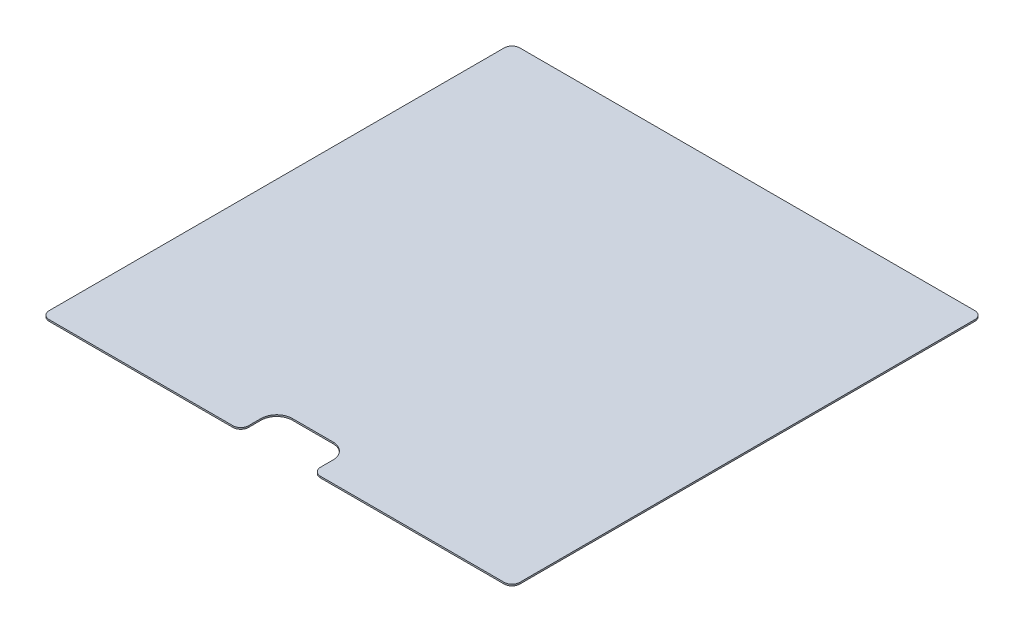
ISO-10303-21;
HEADER;
FILE_DESCRIPTION(('STEP AP214'),'2;1');
FILE_NAME('part.step','',(''),(''),'','','');
FILE_SCHEMA(('AUTOMOTIVE_DESIGN { 1 0 10303 214 1 1 1 1 }'));
ENDSEC;
DATA;
#1=APPLICATION_CONTEXT('core data for automotive mechanical design processes');
#2=APPLICATION_PROTOCOL_DEFINITION('international standard','automotive_design',2000,#1);
#3=PRODUCT_CONTEXT('',#1,'mechanical');
#4=PRODUCT('Part','Part','',(#3));
#5=PRODUCT_RELATED_PRODUCT_CATEGORY('part','',(#4));
#6=PRODUCT_DEFINITION_FORMATION('','',#4);
#7=PRODUCT_DEFINITION_CONTEXT('part definition',#1,'design');
#8=PRODUCT_DEFINITION('design','',#6,#7);
#9=PRODUCT_DEFINITION_SHAPE('','',#8);
#10=(LENGTH_UNIT() NAMED_UNIT(*) SI_UNIT(.MILLI.,.METRE.));
#11=(NAMED_UNIT(*) PLANE_ANGLE_UNIT() SI_UNIT($,.RADIAN.));
#12=(NAMED_UNIT(*) SI_UNIT($,.STERADIAN.) SOLID_ANGLE_UNIT());
#13=UNCERTAINTY_MEASURE_WITH_UNIT(LENGTH_MEASURE(1.E-05),#10,'distance_accuracy_value','');
#14=(GEOMETRIC_REPRESENTATION_CONTEXT(3) GLOBAL_UNCERTAINTY_ASSIGNED_CONTEXT((#13)) GLOBAL_UNIT_ASSIGNED_CONTEXT((#10,
#11,#12)) REPRESENTATION_CONTEXT('',''));
#15=CARTESIAN_POINT('',(0.,0.,0.));
#16=DIRECTION('',(0.,0.,1.));
#17=DIRECTION('',(1.,0.,0.));
#18=AXIS2_PLACEMENT_3D('',#15,#16,#17);
#19=CARTESIAN_POINT('',(-14.5,0.05,-14.5));
#20=DIRECTION('',(0.,-1.,0.));
#21=DIRECTION('',(0.,0.,-1.));
#22=AXIS2_PLACEMENT_3D('',#19,#20,#21);
#23=CYLINDRICAL_SURFACE('',#22,0.5);
#24=CARTESIAN_POINT('',(-14.5,-0.05,-14.5));
#25=DIRECTION('',(0.,1.,0.));
#26=DIRECTION('',(0.,0.,1.));
#27=AXIS2_PLACEMENT_3D('',#24,#25,#26);
#28=CIRCLE('',#27,0.5);
#29=CARTESIAN_POINT('',(-14.5,-0.05,-15.));
#30=VERTEX_POINT('',#29);
#31=CARTESIAN_POINT('',(-15.,-0.05,-14.5));
#32=VERTEX_POINT('',#31);
#33=EDGE_CURVE('E188',#30,#32,#28,.T.);
#34=ORIENTED_EDGE('',*,*,#33,.T.);
#35=DIRECTION('',(0.,-1.,0.));
#36=VECTOR('',#35,1.);
#37=CARTESIAN_POINT('',(-15.,0.05,-14.5));
#38=LINE('',#37,#36);
#39=CARTESIAN_POINT('',(-15.,0.05,-14.5));
#40=VERTEX_POINT('',#39);
#41=EDGE_CURVE('E11',#40,#32,#38,.T.);
#42=ORIENTED_EDGE('',*,*,#41,.F.);
#43=CARTESIAN_POINT('',(-14.5,0.05,-14.5));
#44=DIRECTION('',(0.,1.,0.));
#45=DIRECTION('',(0.,0.,1.));
#46=AXIS2_PLACEMENT_3D('',#43,#44,#45);
#47=CIRCLE('',#46,0.5);
#48=CARTESIAN_POINT('',(-14.5,0.05,-15.));
#49=VERTEX_POINT('',#48);
#50=EDGE_CURVE('E234',#49,#40,#47,.T.);
#51=ORIENTED_EDGE('',*,*,#50,.F.);
#52=DIRECTION('',(0.,-1.,0.));
#53=VECTOR('',#52,1.);
#54=CARTESIAN_POINT('',(-14.5,0.05,-15.));
#55=LINE('',#54,#53);
#56=EDGE_CURVE('E184',#49,#30,#55,.T.);
#57=ORIENTED_EDGE('',*,*,#56,.T.);
#58=EDGE_LOOP('',(#34,#42,#51,#57));
#59=FACE_BOUND('',#58,.T.);
#60=ADVANCED_FACE('F39',(#59),#23,.T.);
#61=CARTESIAN_POINT('',(-15.,0.05,14.5));
#62=DIRECTION('',(1.,0.,0.));
#63=DIRECTION('',(0.,0.,-1.));
#64=AXIS2_PLACEMENT_3D('',#61,#62,#63);
#65=PLANE('',#64);
#66=DIRECTION('',(0.,0.,1.));
#67=VECTOR('',#66,1.);
#68=CARTESIAN_POINT('',(-15.,-0.05,14.5));
#69=LINE('',#68,#67);
#70=CARTESIAN_POINT('',(-15.,-0.05,14.5));
#71=VERTEX_POINT('',#70);
#72=EDGE_CURVE('E192',#32,#71,#69,.T.);
#73=ORIENTED_EDGE('',*,*,#72,.T.);
#74=DIRECTION('',(0.,-1.,0.));
#75=VECTOR('',#74,1.);
#76=CARTESIAN_POINT('',(-15.,0.05,14.5));
#77=LINE('',#76,#75);
#78=CARTESIAN_POINT('',(-15.,0.05,14.5));
#79=VERTEX_POINT('',#78);
#80=EDGE_CURVE('E48',#79,#71,#77,.T.);
#81=ORIENTED_EDGE('',*,*,#80,.F.);
#82=DIRECTION('',(0.,0.,1.));
#83=VECTOR('',#82,1.);
#84=CARTESIAN_POINT('',(-15.,0.05,14.5));
#85=LINE('',#84,#83);
#86=EDGE_CURVE('E123',#40,#79,#85,.T.);
#87=ORIENTED_EDGE('',*,*,#86,.F.);
#88=ORIENTED_EDGE('',*,*,#41,.T.);
#89=EDGE_LOOP('',(#73,#81,#87,#88));
#90=FACE_BOUND('',#89,.T.);
#91=ADVANCED_FACE('F356',(#90),#65,.F.);
#92=CARTESIAN_POINT('',(-14.5,0.05,14.5));
#93=DIRECTION('',(0.,-1.,0.));
#94=DIRECTION('',(0.,0.,-1.));
#95=AXIS2_PLACEMENT_3D('',#92,#93,#94);
#96=CYLINDRICAL_SURFACE('',#95,0.5);
#97=CARTESIAN_POINT('',(-14.5,-0.05,14.5));
#98=DIRECTION('',(0.,1.,0.));
#99=DIRECTION('',(0.,0.,-1.));
#100=AXIS2_PLACEMENT_3D('',#97,#98,#99);
#101=CIRCLE('',#100,0.5);
#102=CARTESIAN_POINT('',(-14.5,-0.05,15.));
#103=VERTEX_POINT('',#102);
#104=EDGE_CURVE('E195',#71,#103,#101,.T.);
#105=ORIENTED_EDGE('',*,*,#104,.T.);
#106=DIRECTION('',(0.,-1.,0.));
#107=VECTOR('',#106,1.);
#108=CARTESIAN_POINT('',(-14.5,0.05,15.));
#109=LINE('',#108,#107);
#110=CARTESIAN_POINT('',(-14.5,0.05,15.));
#111=VERTEX_POINT('',#110);
#112=EDGE_CURVE('E277',#111,#103,#109,.T.);
#113=ORIENTED_EDGE('',*,*,#112,.F.);
#114=CARTESIAN_POINT('',(-14.5,0.05,14.5));
#115=DIRECTION('',(0.,1.,0.));
#116=DIRECTION('',(0.,0.,-1.));
#117=AXIS2_PLACEMENT_3D('',#114,#115,#116);
#118=CIRCLE('',#117,0.5);
#119=EDGE_CURVE('E287',#79,#111,#118,.T.);
#120=ORIENTED_EDGE('',*,*,#119,.F.);
#121=ORIENTED_EDGE('',*,*,#80,.T.);
#122=EDGE_LOOP('',(#105,#113,#120,#121));
#123=FACE_BOUND('',#122,.T.);
#124=ADVANCED_FACE('F285',(#123),#96,.T.);
#125=CARTESIAN_POINT('',(-2.7929,0.05,15.));
#126=DIRECTION('',(0.,0.,-1.));
#127=DIRECTION('',(-1.,0.,0.));
#128=AXIS2_PLACEMENT_3D('',#125,#126,#127);
#129=PLANE('',#128);
#130=DIRECTION('',(1.,0.,0.));
#131=VECTOR('',#130,1.);
#132=CARTESIAN_POINT('',(-2.7929,-0.05,15.));
#133=LINE('',#132,#131);
#134=CARTESIAN_POINT('',(-2.7929,-0.05,15.));
#135=VERTEX_POINT('',#134);
#136=EDGE_CURVE('E198',#103,#135,#133,.T.);
#137=ORIENTED_EDGE('',*,*,#136,.T.);
#138=DIRECTION('',(0.,-1.,0.));
#139=VECTOR('',#138,1.);
#140=CARTESIAN_POINT('',(-2.7929,0.05,15.));
#141=LINE('',#140,#139);
#142=CARTESIAN_POINT('',(-2.7929,0.05,15.));
#143=VERTEX_POINT('',#142);
#144=EDGE_CURVE('E273',#143,#135,#141,.T.);
#145=ORIENTED_EDGE('',*,*,#144,.F.);
#146=DIRECTION('',(1.,0.,0.));
#147=VECTOR('',#146,1.);
#148=CARTESIAN_POINT('',(-2.7929,0.05,15.));
#149=LINE('',#148,#147);
#150=EDGE_CURVE('E306',#111,#143,#149,.T.);
#151=ORIENTED_EDGE('',*,*,#150,.F.);
#152=ORIENTED_EDGE('',*,*,#112,.T.);
#153=EDGE_LOOP('',(#137,#145,#151,#152));
#154=FACE_BOUND('',#153,.T.);
#155=ADVANCED_FACE('F296',(#154),#129,.F.);
#156=CARTESIAN_POINT('',(-2.7929,0.05,14.5));
#157=DIRECTION('',(0.,-1.,0.));
#158=DIRECTION('',(0.,0.,-1.));
#159=AXIS2_PLACEMENT_3D('',#156,#157,#158);
#160=CYLINDRICAL_SURFACE('',#159,0.5);
#161=CARTESIAN_POINT('',(-2.7929,-0.05,14.5));
#162=DIRECTION('',(0.,1.,0.));
#163=DIRECTION('',(0.,0.,-1.));
#164=AXIS2_PLACEMENT_3D('',#161,#162,#163);
#165=CIRCLE('',#164,0.5);
#166=CARTESIAN_POINT('',(-2.2929,-0.05,14.5));
#167=VERTEX_POINT('',#166);
#168=EDGE_CURVE('E201',#135,#167,#165,.T.);
#169=ORIENTED_EDGE('',*,*,#168,.T.);
#170=DIRECTION('',(0.,-1.,0.));
#171=VECTOR('',#170,1.);
#172=CARTESIAN_POINT('',(-2.2929,0.05,14.5));
#173=LINE('',#172,#171);
#174=CARTESIAN_POINT('',(-2.2929,0.05,14.5));
#175=VERTEX_POINT('',#174);
#176=EDGE_CURVE('E269',#175,#167,#173,.T.);
#177=ORIENTED_EDGE('',*,*,#176,.F.);
#178=CARTESIAN_POINT('',(-2.7929,0.05,14.5));
#179=DIRECTION('',(0.,1.,0.));
#180=DIRECTION('',(0.,0.,-1.));
#181=AXIS2_PLACEMENT_3D('',#178,#179,#180);
#182=CIRCLE('',#181,0.5);
#183=EDGE_CURVE('E302',#143,#175,#182,.T.);
#184=ORIENTED_EDGE('',*,*,#183,.F.);
#185=ORIENTED_EDGE('',*,*,#144,.T.);
#186=EDGE_LOOP('',(#169,#177,#184,#185));
#187=FACE_BOUND('',#186,.T.);
#188=ADVANCED_FACE('F300',(#187),#160,.T.);
#189=CARTESIAN_POINT('',(-2.2929,0.05,13.7071));
#190=DIRECTION('',(-1.,0.,0.));
#191=DIRECTION('',(0.,0.,1.));
#192=AXIS2_PLACEMENT_3D('',#189,#190,#191);
#193=PLANE('',#192);
#194=DIRECTION('',(0.,0.,-1.));
#195=VECTOR('',#194,1.);
#196=CARTESIAN_POINT('',(-2.2929,-0.05,13.7071));
#197=LINE('',#196,#195);
#198=CARTESIAN_POINT('',(-2.2929,-0.05,13.7071));
#199=VERTEX_POINT('',#198);
#200=EDGE_CURVE('E204',#167,#199,#197,.T.);
#201=ORIENTED_EDGE('',*,*,#200,.T.);
#202=DIRECTION('',(0.,-1.,0.));
#203=VECTOR('',#202,1.);
#204=CARTESIAN_POINT('',(-2.2929,0.05,13.7071));
#205=LINE('',#204,#203);
#206=CARTESIAN_POINT('',(-2.2929,0.05,13.7071));
#207=VERTEX_POINT('',#206);
#208=EDGE_CURVE('E265',#207,#199,#205,.T.);
#209=ORIENTED_EDGE('',*,*,#208,.F.);
#210=DIRECTION('',(0.,0.,-1.));
#211=VECTOR('',#210,1.);
#212=CARTESIAN_POINT('',(-2.2929,0.05,13.7071));
#213=LINE('',#212,#211);
#214=EDGE_CURVE('E305',#175,#207,#213,.T.);
#215=ORIENTED_EDGE('',*,*,#214,.F.);
#216=ORIENTED_EDGE('',*,*,#176,.T.);
#217=EDGE_LOOP('',(#201,#209,#215,#216));
#218=FACE_BOUND('',#217,.T.);
#219=ADVANCED_FACE('F369',(#218),#193,.F.);
#220=CARTESIAN_POINT('',(-1.2929,0.05,13.7071));
#221=DIRECTION('',(0.,-1.,0.));
#222=DIRECTION('',(0.,0.,-1.));
#223=AXIS2_PLACEMENT_3D('',#220,#221,#222);
#224=CYLINDRICAL_SURFACE('',#223,0.999999999999999);
#225=CARTESIAN_POINT('',(-1.2929,-0.05,13.7071));
#226=DIRECTION('',(0.,-1.,0.));
#227=DIRECTION('',(0.,0.,1.));
#228=AXIS2_PLACEMENT_3D('',#225,#226,#227);
#229=CIRCLE('',#228,0.999999999999999);
#230=CARTESIAN_POINT('',(-1.29289999999999,-0.05,12.7071));
#231=VERTEX_POINT('',#230);
#232=EDGE_CURVE('E207',#199,#231,#229,.T.);
#233=ORIENTED_EDGE('',*,*,#232,.T.);
#234=DIRECTION('',(0.,-1.,0.));
#235=VECTOR('',#234,1.);
#236=CARTESIAN_POINT('',(-1.29289999999999,0.05,12.7071));
#237=LINE('',#236,#235);
#238=CARTESIAN_POINT('',(-1.29289999999999,0.05,12.7071));
#239=VERTEX_POINT('',#238);
#240=EDGE_CURVE('E261',#239,#231,#237,.T.);
#241=ORIENTED_EDGE('',*,*,#240,.F.);
#242=CARTESIAN_POINT('',(-1.2929,0.05,13.7071));
#243=DIRECTION('',(0.,-1.,0.));
#244=DIRECTION('',(0.,0.,1.));
#245=AXIS2_PLACEMENT_3D('',#242,#243,#244);
#246=CIRCLE('',#245,0.999999999999999);
#247=EDGE_CURVE('E310',#207,#239,#246,.T.);
#248=ORIENTED_EDGE('',*,*,#247,.F.);
#249=ORIENTED_EDGE('',*,*,#208,.T.);
#250=EDGE_LOOP('',(#233,#241,#248,#249));
#251=FACE_BOUND('',#250,.T.);
#252=ADVANCED_FACE('F372',(#251),#224,.F.);
#253=CARTESIAN_POINT('',(1.29289999999999,0.05,12.7071));
#254=DIRECTION('',(0.,0.,-1.));
#255=DIRECTION('',(-1.,0.,0.));
#256=AXIS2_PLACEMENT_3D('',#253,#254,#255);
#257=PLANE('',#256);
#258=DIRECTION('',(1.,0.,0.));
#259=VECTOR('',#258,1.);
#260=CARTESIAN_POINT('',(1.29289999999999,-0.05,12.7071));
#261=LINE('',#260,#259);
#262=CARTESIAN_POINT('',(1.29289999999999,-0.05,12.7071));
#263=VERTEX_POINT('',#262);
#264=EDGE_CURVE('E210',#231,#263,#261,.T.);
#265=ORIENTED_EDGE('',*,*,#264,.T.);
#266=DIRECTION('',(0.,-1.,0.));
#267=VECTOR('',#266,1.);
#268=CARTESIAN_POINT('',(1.29289999999999,0.05,12.7071));
#269=LINE('',#268,#267);
#270=CARTESIAN_POINT('',(1.29289999999999,0.05,12.7071));
#271=VERTEX_POINT('',#270);
#272=EDGE_CURVE('E257',#271,#263,#269,.T.);
#273=ORIENTED_EDGE('',*,*,#272,.F.);
#274=DIRECTION('',(1.,0.,0.));
#275=VECTOR('',#274,1.);
#276=CARTESIAN_POINT('',(1.29289999999999,0.05,12.7071));
#277=LINE('',#276,#275);
#278=EDGE_CURVE('E317',#239,#271,#277,.T.);
#279=ORIENTED_EDGE('',*,*,#278,.F.);
#280=ORIENTED_EDGE('',*,*,#240,.T.);
#281=EDGE_LOOP('',(#265,#273,#279,#280));
#282=FACE_BOUND('',#281,.T.);
#283=ADVANCED_FACE('F376',(#282),#257,.F.);
#284=CARTESIAN_POINT('',(1.2929,0.05,13.7071));
#285=DIRECTION('',(0.,-1.,0.));
#286=DIRECTION('',(0.,0.,-1.));
#287=AXIS2_PLACEMENT_3D('',#284,#285,#286);
#288=CYLINDRICAL_SURFACE('',#287,1.);
#289=CARTESIAN_POINT('',(1.2929,-0.05,13.7071));
#290=DIRECTION('',(0.,-1.,0.));
#291=DIRECTION('',(0.,0.,1.));
#292=AXIS2_PLACEMENT_3D('',#289,#290,#291);
#293=CIRCLE('',#292,1.);
#294=CARTESIAN_POINT('',(2.2929,-0.05,13.7071));
#295=VERTEX_POINT('',#294);
#296=EDGE_CURVE('E213',#263,#295,#293,.T.);
#297=ORIENTED_EDGE('',*,*,#296,.T.);
#298=DIRECTION('',(0.,-1.,0.));
#299=VECTOR('',#298,1.);
#300=CARTESIAN_POINT('',(2.2929,0.05,13.7071));
#301=LINE('',#300,#299);
#302=CARTESIAN_POINT('',(2.2929,0.05,13.7071));
#303=VERTEX_POINT('',#302);
#304=EDGE_CURVE('E253',#303,#295,#301,.T.);
#305=ORIENTED_EDGE('',*,*,#304,.F.);
#306=CARTESIAN_POINT('',(1.2929,0.05,13.7071));
#307=DIRECTION('',(0.,-1.,0.));
#308=DIRECTION('',(0.,0.,1.));
#309=AXIS2_PLACEMENT_3D('',#306,#307,#308);
#310=CIRCLE('',#309,1.);
#311=EDGE_CURVE('E320',#271,#303,#310,.T.);
#312=ORIENTED_EDGE('',*,*,#311,.F.);
#313=ORIENTED_EDGE('',*,*,#272,.T.);
#314=EDGE_LOOP('',(#297,#305,#312,#313));
#315=FACE_BOUND('',#314,.T.);
#316=ADVANCED_FACE('F380',(#315),#288,.F.);
#317=CARTESIAN_POINT('',(2.2929,0.05,14.5));
#318=DIRECTION('',(1.,0.,0.));
#319=DIRECTION('',(0.,0.,-1.));
#320=AXIS2_PLACEMENT_3D('',#317,#318,#319);
#321=PLANE('',#320);
#322=DIRECTION('',(0.,0.,1.));
#323=VECTOR('',#322,1.);
#324=CARTESIAN_POINT('',(2.2929,-0.05,14.5));
#325=LINE('',#324,#323);
#326=CARTESIAN_POINT('',(2.2929,-0.05,14.5));
#327=VERTEX_POINT('',#326);
#328=EDGE_CURVE('E216',#295,#327,#325,.T.);
#329=ORIENTED_EDGE('',*,*,#328,.T.);
#330=DIRECTION('',(0.,-1.,0.));
#331=VECTOR('',#330,1.);
#332=CARTESIAN_POINT('',(2.2929,0.05,14.5));
#333=LINE('',#332,#331);
#334=CARTESIAN_POINT('',(2.2929,0.05,14.5));
#335=VERTEX_POINT('',#334);
#336=EDGE_CURVE('E249',#335,#327,#333,.T.);
#337=ORIENTED_EDGE('',*,*,#336,.F.);
#338=DIRECTION('',(0.,0.,1.));
#339=VECTOR('',#338,1.);
#340=CARTESIAN_POINT('',(2.2929,0.05,14.5));
#341=LINE('',#340,#339);
#342=EDGE_CURVE('E323',#303,#335,#341,.T.);
#343=ORIENTED_EDGE('',*,*,#342,.F.);
#344=ORIENTED_EDGE('',*,*,#304,.T.);
#345=EDGE_LOOP('',(#329,#337,#343,#344));
#346=FACE_BOUND('',#345,.T.);
#347=ADVANCED_FACE('F384',(#346),#321,.F.);
#348=CARTESIAN_POINT('',(2.7929,0.05,14.5));
#349=DIRECTION('',(0.,-1.,0.));
#350=DIRECTION('',(0.,0.,-1.));
#351=AXIS2_PLACEMENT_3D('',#348,#349,#350);
#352=CYLINDRICAL_SURFACE('',#351,0.5);
#353=CARTESIAN_POINT('',(2.7929,-0.05,14.5));
#354=DIRECTION('',(0.,1.,0.));
#355=DIRECTION('',(0.,0.,1.));
#356=AXIS2_PLACEMENT_3D('',#353,#354,#355);
#357=CIRCLE('',#356,0.5);
#358=CARTESIAN_POINT('',(2.7929,-0.05,15.));
#359=VERTEX_POINT('',#358);
#360=EDGE_CURVE('E219',#327,#359,#357,.T.);
#361=ORIENTED_EDGE('',*,*,#360,.T.);
#362=DIRECTION('',(0.,-1.,0.));
#363=VECTOR('',#362,1.);
#364=CARTESIAN_POINT('',(2.7929,0.05,15.));
#365=LINE('',#364,#363);
#366=CARTESIAN_POINT('',(2.7929,0.05,15.));
#367=VERTEX_POINT('',#366);
#368=EDGE_CURVE('E245',#367,#359,#365,.T.);
#369=ORIENTED_EDGE('',*,*,#368,.F.);
#370=CARTESIAN_POINT('',(2.7929,0.05,14.5));
#371=DIRECTION('',(0.,1.,0.));
#372=DIRECTION('',(0.,0.,1.));
#373=AXIS2_PLACEMENT_3D('',#370,#371,#372);
#374=CIRCLE('',#373,0.5);
#375=EDGE_CURVE('E326',#335,#367,#374,.T.);
#376=ORIENTED_EDGE('',*,*,#375,.F.);
#377=ORIENTED_EDGE('',*,*,#336,.T.);
#378=EDGE_LOOP('',(#361,#369,#376,#377));
#379=FACE_BOUND('',#378,.T.);
#380=ADVANCED_FACE('F388',(#379),#352,.T.);
#381=CARTESIAN_POINT('',(14.5,0.05,15.));
#382=DIRECTION('',(0.,0.,-1.));
#383=DIRECTION('',(-1.,0.,0.));
#384=AXIS2_PLACEMENT_3D('',#381,#382,#383);
#385=PLANE('',#384);
#386=DIRECTION('',(1.,0.,0.));
#387=VECTOR('',#386,1.);
#388=CARTESIAN_POINT('',(14.5,-0.05,15.));
#389=LINE('',#388,#387);
#390=CARTESIAN_POINT('',(14.5,-0.05,15.));
#391=VERTEX_POINT('',#390);
#392=EDGE_CURVE('E222',#359,#391,#389,.T.);
#393=ORIENTED_EDGE('',*,*,#392,.T.);
#394=DIRECTION('',(0.,-1.,0.));
#395=VECTOR('',#394,1.);
#396=CARTESIAN_POINT('',(14.5,0.05,15.));
#397=LINE('',#396,#395);
#398=CARTESIAN_POINT('',(14.5,0.05,15.));
#399=VERTEX_POINT('',#398);
#400=EDGE_CURVE('E241',#399,#391,#397,.T.);
#401=ORIENTED_EDGE('',*,*,#400,.F.);
#402=DIRECTION('',(1.,0.,0.));
#403=VECTOR('',#402,1.);
#404=CARTESIAN_POINT('',(14.5,0.05,15.));
#405=LINE('',#404,#403);
#406=EDGE_CURVE('E329',#367,#399,#405,.T.);
#407=ORIENTED_EDGE('',*,*,#406,.F.);
#408=ORIENTED_EDGE('',*,*,#368,.T.);
#409=EDGE_LOOP('',(#393,#401,#407,#408));
#410=FACE_BOUND('',#409,.T.);
#411=ADVANCED_FACE('F337',(#410),#385,.F.);
#412=CARTESIAN_POINT('',(14.5,0.05,14.5));
#413=DIRECTION('',(0.,-1.,0.));
#414=DIRECTION('',(0.,0.,-1.));
#415=AXIS2_PLACEMENT_3D('',#412,#413,#414);
#416=CYLINDRICAL_SURFACE('',#415,0.5);
#417=CARTESIAN_POINT('',(14.5,-0.05,14.5));
#418=DIRECTION('',(0.,1.,0.));
#419=DIRECTION('',(0.,0.,1.));
#420=AXIS2_PLACEMENT_3D('',#417,#418,#419);
#421=CIRCLE('',#420,0.5);
#422=CARTESIAN_POINT('',(15.,-0.05,14.5));
#423=VERTEX_POINT('',#422);
#424=EDGE_CURVE('E225',#391,#423,#421,.T.);
#425=ORIENTED_EDGE('',*,*,#424,.T.);
#426=DIRECTION('',(0.,-1.,0.));
#427=VECTOR('',#426,1.);
#428=CARTESIAN_POINT('',(15.,0.05,14.5));
#429=LINE('',#428,#427);
#430=CARTESIAN_POINT('',(15.,0.05,14.5));
#431=VERTEX_POINT('',#430);
#432=EDGE_CURVE('E177',#431,#423,#429,.T.);
#433=ORIENTED_EDGE('',*,*,#432,.F.);
#434=CARTESIAN_POINT('',(14.5,0.05,14.5));
#435=DIRECTION('',(0.,1.,0.));
#436=DIRECTION('',(0.,0.,1.));
#437=AXIS2_PLACEMENT_3D('',#434,#435,#436);
#438=CIRCLE('',#437,0.5);
#439=EDGE_CURVE('E166',#399,#431,#438,.T.);
#440=ORIENTED_EDGE('',*,*,#439,.F.);
#441=ORIENTED_EDGE('',*,*,#400,.T.);
#442=EDGE_LOOP('',(#425,#433,#440,#441));
#443=FACE_BOUND('',#442,.T.);
#444=ADVANCED_FACE('F341',(#443),#416,.T.);
#445=CARTESIAN_POINT('',(15.,0.05,14.5));
#446=DIRECTION('',(-1.,0.,0.));
#447=DIRECTION('',(0.,0.,1.));
#448=AXIS2_PLACEMENT_3D('',#445,#446,#447);
#449=PLANE('',#448);
#450=DIRECTION('',(0.,0.,-1.));
#451=VECTOR('',#450,1.);
#452=CARTESIAN_POINT('',(15.,-0.05,14.5));
#453=LINE('',#452,#451);
#454=CARTESIAN_POINT('',(15.,-0.05,-14.5));
#455=VERTEX_POINT('',#454);
#456=EDGE_CURVE('E175',#423,#455,#453,.T.);
#457=ORIENTED_EDGE('',*,*,#456,.T.);
#458=DIRECTION('',(0.,-1.,0.));
#459=VECTOR('',#458,1.);
#460=CARTESIAN_POINT('',(15.,0.05,-14.5));
#461=LINE('',#460,#459);
#462=CARTESIAN_POINT('',(15.,0.05,-14.5));
#463=VERTEX_POINT('',#462);
#464=EDGE_CURVE('E172',#463,#455,#461,.T.);
#465=ORIENTED_EDGE('',*,*,#464,.F.);
#466=DIRECTION('',(0.,0.,-1.));
#467=VECTOR('',#466,1.);
#468=CARTESIAN_POINT('',(15.,0.05,14.5));
#469=LINE('',#468,#467);
#470=EDGE_CURVE('E160',#431,#463,#469,.T.);
#471=ORIENTED_EDGE('',*,*,#470,.F.);
#472=ORIENTED_EDGE('',*,*,#432,.T.);
#473=EDGE_LOOP('',(#457,#465,#471,#472));
#474=FACE_BOUND('',#473,.T.);
#475=ADVANCED_FACE('F173',(#474),#449,.F.);
#476=CARTESIAN_POINT('',(14.5,0.05,-14.5));
#477=DIRECTION('',(0.,-1.,0.));
#478=DIRECTION('',(0.,0.,-1.));
#479=AXIS2_PLACEMENT_3D('',#476,#477,#478);
#480=CYLINDRICAL_SURFACE('',#479,0.5);
#481=CARTESIAN_POINT('',(14.5,-0.05,-14.5));
#482=DIRECTION('',(0.,1.,0.));
#483=DIRECTION('',(0.,0.,1.));
#484=AXIS2_PLACEMENT_3D('',#481,#482,#483);
#485=CIRCLE('',#484,0.5);
#486=CARTESIAN_POINT('',(14.5,-0.05,-15.));
#487=VERTEX_POINT('',#486);
#488=EDGE_CURVE('E109',#455,#487,#485,.T.);
#489=ORIENTED_EDGE('',*,*,#488,.T.);
#490=DIRECTION('',(0.,-1.,0.));
#491=VECTOR('',#490,1.);
#492=CARTESIAN_POINT('',(14.5,0.05,-15.));
#493=LINE('',#492,#491);
#494=CARTESIAN_POINT('',(14.5,0.05,-15.));
#495=VERTEX_POINT('',#494);
#496=EDGE_CURVE('E178',#495,#487,#493,.T.);
#497=ORIENTED_EDGE('',*,*,#496,.F.);
#498=CARTESIAN_POINT('',(14.5,0.05,-14.5));
#499=DIRECTION('',(0.,1.,0.));
#500=DIRECTION('',(0.,0.,1.));
#501=AXIS2_PLACEMENT_3D('',#498,#499,#500);
#502=CIRCLE('',#501,0.5);
#503=EDGE_CURVE('E164',#463,#495,#502,.T.);
#504=ORIENTED_EDGE('',*,*,#503,.F.);
#505=ORIENTED_EDGE('',*,*,#464,.T.);
#506=EDGE_LOOP('',(#489,#497,#504,#505));
#507=FACE_BOUND('',#506,.T.);
#508=ADVANCED_FACE('F180',(#507),#480,.T.);
#509=CARTESIAN_POINT('',(14.5,0.05,-15.));
#510=DIRECTION('',(0.,0.,1.));
#511=DIRECTION('',(1.,0.,0.));
#512=AXIS2_PLACEMENT_3D('',#509,#510,#511);
#513=PLANE('',#512);
#514=DIRECTION('',(-1.,0.,0.));
#515=VECTOR('',#514,1.);
#516=CARTESIAN_POINT('',(14.5,-0.05,-15.));
#517=LINE('',#516,#515);
#518=EDGE_CURVE('E115',#487,#30,#517,.T.);
#519=ORIENTED_EDGE('',*,*,#518,.T.);
#520=ORIENTED_EDGE('',*,*,#56,.F.);
#521=DIRECTION('',(-1.,0.,0.));
#522=VECTOR('',#521,1.);
#523=CARTESIAN_POINT('',(14.5,0.05,-15.));
#524=LINE('',#523,#522);
#525=EDGE_CURVE('E56',#495,#49,#524,.T.);
#526=ORIENTED_EDGE('',*,*,#525,.F.);
#527=ORIENTED_EDGE('',*,*,#496,.T.);
#528=EDGE_LOOP('',(#519,#520,#526,#527));
#529=FACE_BOUND('',#528,.T.);
#530=ADVANCED_FACE('F345',(#529),#513,.F.);
#531=CARTESIAN_POINT('',(-14.5,0.05,-14.5));
#532=DIRECTION('',(0.,1.,0.));
#533=DIRECTION('',(0.,0.,1.));
#534=AXIS2_PLACEMENT_3D('',#531,#532,#533);
#535=PLANE('',#534);
#536=ORIENTED_EDGE('',*,*,#50,.T.);
#537=ORIENTED_EDGE('',*,*,#86,.T.);
#538=ORIENTED_EDGE('',*,*,#119,.T.);
#539=ORIENTED_EDGE('',*,*,#150,.T.);
#540=ORIENTED_EDGE('',*,*,#183,.T.);
#541=ORIENTED_EDGE('',*,*,#214,.T.);
#542=ORIENTED_EDGE('',*,*,#247,.T.);
#543=ORIENTED_EDGE('',*,*,#278,.T.);
#544=ORIENTED_EDGE('',*,*,#311,.T.);
#545=ORIENTED_EDGE('',*,*,#342,.T.);
#546=ORIENTED_EDGE('',*,*,#375,.T.);
#547=ORIENTED_EDGE('',*,*,#406,.T.);
#548=ORIENTED_EDGE('',*,*,#439,.T.);
#549=ORIENTED_EDGE('',*,*,#470,.T.);
#550=ORIENTED_EDGE('',*,*,#503,.T.);
#551=ORIENTED_EDGE('',*,*,#525,.T.);
#552=EDGE_LOOP('',(#536,#537,#538,#539,#540,#541,#542,#543,#544,#545,#546,#547,#548,#549,#550,#551));
#553=FACE_BOUND('',#552,.T.);
#554=ADVANCED_FACE('F162',(#553),#535,.T.);
#555=CARTESIAN_POINT('',(-14.5,-0.05,-14.5));
#556=DIRECTION('',(0.,1.,0.));
#557=DIRECTION('',(0.,0.,1.));
#558=AXIS2_PLACEMENT_3D('',#555,#556,#557);
#559=PLANE('',#558);
#560=ORIENTED_EDGE('',*,*,#33,.F.);
#561=ORIENTED_EDGE('',*,*,#518,.F.);
#562=ORIENTED_EDGE('',*,*,#488,.F.);
#563=ORIENTED_EDGE('',*,*,#456,.F.);
#564=ORIENTED_EDGE('',*,*,#424,.F.);
#565=ORIENTED_EDGE('',*,*,#392,.F.);
#566=ORIENTED_EDGE('',*,*,#360,.F.);
#567=ORIENTED_EDGE('',*,*,#328,.F.);
#568=ORIENTED_EDGE('',*,*,#296,.F.);
#569=ORIENTED_EDGE('',*,*,#264,.F.);
#570=ORIENTED_EDGE('',*,*,#232,.F.);
#571=ORIENTED_EDGE('',*,*,#200,.F.);
#572=ORIENTED_EDGE('',*,*,#168,.F.);
#573=ORIENTED_EDGE('',*,*,#136,.F.);
#574=ORIENTED_EDGE('',*,*,#104,.F.);
#575=ORIENTED_EDGE('',*,*,#72,.F.);
#576=EDGE_LOOP('',(#560,#561,#562,#563,#564,#565,#566,#567,#568,#569,#570,#571,#572,#573,#574,#575));
#577=FACE_BOUND('',#576,.T.);
#578=ADVANCED_FACE('F291',(#577),#559,.F.);
#579=CLOSED_SHELL('',(#60,#91,#124,#155,#188,#219,#252,#283,#316,#347,#380,#411,#444,#475,#508,
#530,#554,#578));
#580=MANIFOLD_SOLID_BREP('B2',#579);
#581=ADVANCED_BREP_SHAPE_REPRESENTATION('',(#18,#580),#14);
#582=SHAPE_DEFINITION_REPRESENTATION(#9,#581);
ENDSEC;
END-ISO-10303-21;
